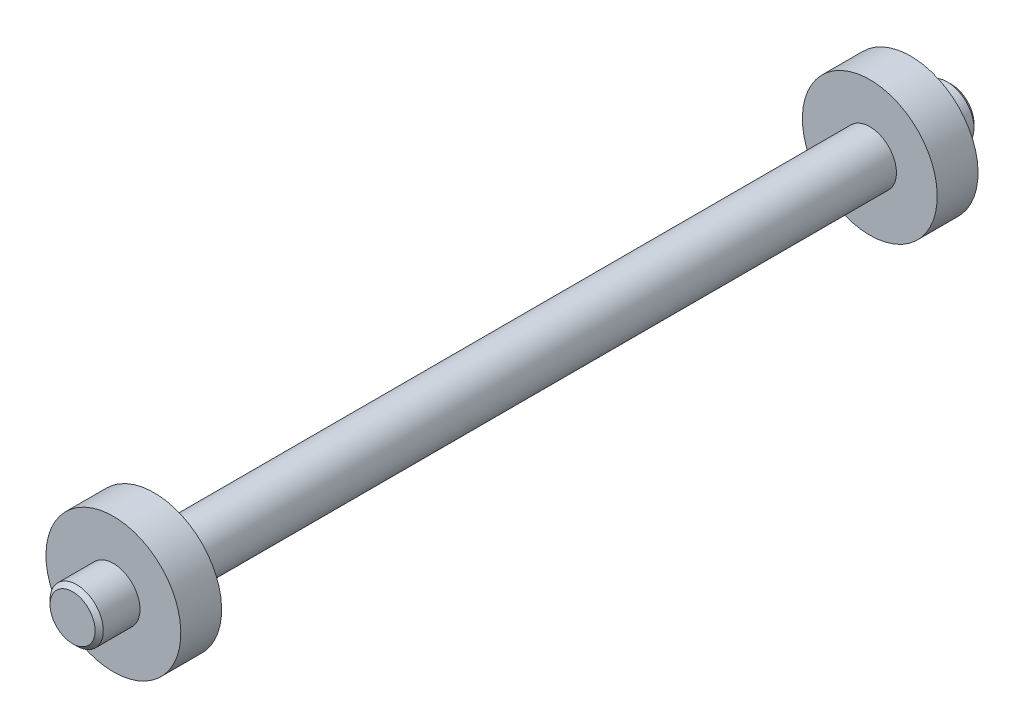
ISO-10303-21;
HEADER;
FILE_DESCRIPTION(('STEP AP214'),'2;1');
FILE_NAME('part.step','',(''),(''),'','','');
FILE_SCHEMA(('AUTOMOTIVE_DESIGN { 1 0 10303 214 1 1 1 1 }'));
ENDSEC;
DATA;
#1=APPLICATION_CONTEXT('core data for automotive mechanical design processes');
#2=APPLICATION_PROTOCOL_DEFINITION('international standard','automotive_design',2000,#1);
#3=PRODUCT_CONTEXT('',#1,'mechanical');
#4=PRODUCT('Part','Part','',(#3));
#5=PRODUCT_RELATED_PRODUCT_CATEGORY('part','',(#4));
#6=PRODUCT_DEFINITION_FORMATION('','',#4);
#7=PRODUCT_DEFINITION_CONTEXT('part definition',#1,'design');
#8=PRODUCT_DEFINITION('design','',#6,#7);
#9=PRODUCT_DEFINITION_SHAPE('','',#8);
#10=(LENGTH_UNIT() NAMED_UNIT(*) SI_UNIT(.MILLI.,.METRE.));
#11=(NAMED_UNIT(*) PLANE_ANGLE_UNIT() SI_UNIT($,.RADIAN.));
#12=(NAMED_UNIT(*) SI_UNIT($,.STERADIAN.) SOLID_ANGLE_UNIT());
#13=UNCERTAINTY_MEASURE_WITH_UNIT(LENGTH_MEASURE(1.E-05),#10,'distance_accuracy_value','');
#14=(GEOMETRIC_REPRESENTATION_CONTEXT(3) GLOBAL_UNCERTAINTY_ASSIGNED_CONTEXT((#13)) GLOBAL_UNIT_ASSIGNED_CONTEXT((#10,
#11,#12)) REPRESENTATION_CONTEXT('',''));
#15=CARTESIAN_POINT('',(0.,0.,0.));
#16=DIRECTION('',(0.,0.,1.));
#17=DIRECTION('',(1.,0.,0.));
#18=AXIS2_PLACEMENT_3D('',#15,#16,#17);
#19=CARTESIAN_POINT('',(0.,1.06,17.5));
#20=DIRECTION('',(0.,0.,-1.));
#21=DIRECTION('',(0.,1.,0.));
#22=AXIS2_PLACEMENT_3D('',#19,#20,#21);
#23=PLANE('',#22);
#24=CARTESIAN_POINT('',(0.,0.,17.5));
#25=DIRECTION('',(0.,0.,-1.));
#26=DIRECTION('',(0.,1.,0.));
#27=AXIS2_PLACEMENT_3D('',#24,#25,#26);
#28=CIRCLE('',#27,0.897499999999999);
#29=CARTESIAN_POINT('',(-0.897499999999997,0.,17.5));
#30=VERTEX_POINT('',#29);
#31=EDGE_CURVE('E36',#30,#30,#28,.F.);
#32=ORIENTED_EDGE('',*,*,#31,.T.);
#33=EDGE_LOOP('',(#32));
#34=FACE_BOUND('',#33,.T.);
#35=ADVANCED_FACE('F29',(#34),#23,.F.);
#36=CARTESIAN_POINT('',(0.,0.,17.5));
#37=DIRECTION('',(0.,0.,1.));
#38=DIRECTION('',(0.,-1.,0.));
#39=AXIS2_PLACEMENT_3D('',#36,#37,#38);
#40=CYLINDRICAL_SURFACE('',#39,1.06);
#41=CARTESIAN_POINT('',(0.,0.,17.3375));
#42=DIRECTION('',(0.,0.,-1.));
#43=DIRECTION('',(-1.,0.,0.));
#44=AXIS2_PLACEMENT_3D('',#41,#42,#43);
#45=CIRCLE('',#44,1.06);
#46=CARTESIAN_POINT('',(-1.06,0.,17.3375));
#47=VERTEX_POINT('',#46);
#48=EDGE_CURVE('E10',#47,#47,#45,.T.);
#49=ORIENTED_EDGE('',*,*,#48,.T.);
#50=EDGE_LOOP('',(#49));
#51=FACE_BOUND('',#50,.T.);
#52=CARTESIAN_POINT('',(0.,0.,15.875));
#53=DIRECTION('',(0.,0.,1.));
#54=DIRECTION('',(0.,-1.,0.));
#55=AXIS2_PLACEMENT_3D('',#52,#53,#54);
#56=CIRCLE('',#55,1.06);
#57=CARTESIAN_POINT('',(0.,-1.06,15.875));
#58=VERTEX_POINT('',#57);
#59=EDGE_CURVE('E49',#58,#58,#56,.T.);
#60=ORIENTED_EDGE('',*,*,#59,.T.);
#61=EDGE_LOOP('',(#60));
#62=FACE_BOUND('',#61,.T.);
#63=ADVANCED_FACE('F92',(#51,#62),#40,.T.);
#64=CARTESIAN_POINT('',(0.,2.685,15.875));
#65=DIRECTION('',(0.,0.,-1.));
#66=DIRECTION('',(0.,1.,0.));
#67=AXIS2_PLACEMENT_3D('',#64,#65,#66);
#68=PLANE('',#67);
#69=ORIENTED_EDGE('',*,*,#59,.F.);
#70=EDGE_LOOP('',(#69));
#71=FACE_BOUND('',#70,.T.);
#72=CARTESIAN_POINT('',(0.,0.,15.875));
#73=DIRECTION('',(0.,0.,1.));
#74=DIRECTION('',(0.,-1.,0.));
#75=AXIS2_PLACEMENT_3D('',#72,#73,#74);
#76=CIRCLE('',#75,2.685);
#77=CARTESIAN_POINT('',(0.,-2.685,15.875));
#78=VERTEX_POINT('',#77);
#79=EDGE_CURVE('E52',#78,#78,#76,.T.);
#80=ORIENTED_EDGE('',*,*,#79,.T.);
#81=EDGE_LOOP('',(#80));
#82=FACE_BOUND('',#81,.T.);
#83=ADVANCED_FACE('F97',(#71,#82),#68,.F.);
#84=CARTESIAN_POINT('',(0.,0.,17.5));
#85=DIRECTION('',(0.,0.,1.));
#86=DIRECTION('',(0.,-1.,0.));
#87=AXIS2_PLACEMENT_3D('',#84,#85,#86);
#88=CYLINDRICAL_SURFACE('',#87,2.685);
#89=ORIENTED_EDGE('',*,*,#79,.F.);
#90=EDGE_LOOP('',(#89));
#91=FACE_BOUND('',#90,.T.);
#92=CARTESIAN_POINT('',(0.,0.,14.25));
#93=DIRECTION('',(0.,0.,1.));
#94=DIRECTION('',(0.,-1.,0.));
#95=AXIS2_PLACEMENT_3D('',#92,#93,#94);
#96=CIRCLE('',#95,2.685);
#97=CARTESIAN_POINT('',(0.,-2.685,14.25));
#98=VERTEX_POINT('',#97);
#99=EDGE_CURVE('E55',#98,#98,#96,.T.);
#100=ORIENTED_EDGE('',*,*,#99,.T.);
#101=EDGE_LOOP('',(#100));
#102=FACE_BOUND('',#101,.T.);
#103=ADVANCED_FACE('F183',(#91,#102),#88,.T.);
#104=CARTESIAN_POINT('',(0.,1.06,14.25));
#105=DIRECTION('',(0.,0.,1.));
#106=DIRECTION('',(0.,-1.,0.));
#107=AXIS2_PLACEMENT_3D('',#104,#105,#106);
#108=PLANE('',#107);
#109=ORIENTED_EDGE('',*,*,#99,.F.);
#110=EDGE_LOOP('',(#109));
#111=FACE_BOUND('',#110,.T.);
#112=CARTESIAN_POINT('',(0.,0.,14.25));
#113=DIRECTION('',(0.,0.,1.));
#114=DIRECTION('',(0.,-1.,0.));
#115=AXIS2_PLACEMENT_3D('',#112,#113,#114);
#116=CIRCLE('',#115,1.06);
#117=CARTESIAN_POINT('',(0.,-1.06,14.25));
#118=VERTEX_POINT('',#117);
#119=EDGE_CURVE('E58',#118,#118,#116,.T.);
#120=ORIENTED_EDGE('',*,*,#119,.T.);
#121=EDGE_LOOP('',(#120));
#122=FACE_BOUND('',#121,.T.);
#123=ADVANCED_FACE('F173',(#111,#122),#108,.F.);
#124=CARTESIAN_POINT('',(0.,0.,17.5));
#125=DIRECTION('',(0.,0.,1.));
#126=DIRECTION('',(0.,-1.,0.));
#127=AXIS2_PLACEMENT_3D('',#124,#125,#126);
#128=CYLINDRICAL_SURFACE('',#127,1.06);
#129=ORIENTED_EDGE('',*,*,#119,.F.);
#130=EDGE_LOOP('',(#129));
#131=FACE_BOUND('',#130,.T.);
#132=CARTESIAN_POINT('',(0.,0.,-14.25));
#133=DIRECTION('',(0.,0.,1.));
#134=DIRECTION('',(0.,-1.,0.));
#135=AXIS2_PLACEMENT_3D('',#132,#133,#134);
#136=CIRCLE('',#135,1.06);
#137=CARTESIAN_POINT('',(0.,-1.06,-14.25));
#138=VERTEX_POINT('',#137);
#139=EDGE_CURVE('E61',#138,#138,#136,.T.);
#140=ORIENTED_EDGE('',*,*,#139,.T.);
#141=EDGE_LOOP('',(#140));
#142=FACE_BOUND('',#141,.T.);
#143=ADVANCED_FACE('F163',(#131,#142),#128,.T.);
#144=CARTESIAN_POINT('',(0.,2.685,-14.25));
#145=DIRECTION('',(0.,0.,-1.));
#146=DIRECTION('',(0.,1.,0.));
#147=AXIS2_PLACEMENT_3D('',#144,#145,#146);
#148=PLANE('',#147);
#149=ORIENTED_EDGE('',*,*,#139,.F.);
#150=EDGE_LOOP('',(#149));
#151=FACE_BOUND('',#150,.T.);
#152=CARTESIAN_POINT('',(0.,0.,-14.25));
#153=DIRECTION('',(0.,0.,1.));
#154=DIRECTION('',(0.,-1.,0.));
#155=AXIS2_PLACEMENT_3D('',#152,#153,#154);
#156=CIRCLE('',#155,2.685);
#157=CARTESIAN_POINT('',(0.,-2.685,-14.25));
#158=VERTEX_POINT('',#157);
#159=EDGE_CURVE('E64',#158,#158,#156,.T.);
#160=ORIENTED_EDGE('',*,*,#159,.T.);
#161=EDGE_LOOP('',(#160));
#162=FACE_BOUND('',#161,.T.);
#163=ADVANCED_FACE('F153',(#151,#162),#148,.F.);
#164=CARTESIAN_POINT('',(0.,0.,17.5));
#165=DIRECTION('',(0.,0.,1.));
#166=DIRECTION('',(0.,-1.,0.));
#167=AXIS2_PLACEMENT_3D('',#164,#165,#166);
#168=CYLINDRICAL_SURFACE('',#167,2.685);
#169=ORIENTED_EDGE('',*,*,#159,.F.);
#170=EDGE_LOOP('',(#169));
#171=FACE_BOUND('',#170,.T.);
#172=CARTESIAN_POINT('',(0.,0.,-15.875));
#173=DIRECTION('',(0.,0.,1.));
#174=DIRECTION('',(0.,-1.,0.));
#175=AXIS2_PLACEMENT_3D('',#172,#173,#174);
#176=CIRCLE('',#175,2.685);
#177=CARTESIAN_POINT('',(0.,-2.685,-15.875));
#178=VERTEX_POINT('',#177);
#179=EDGE_CURVE('E67',#178,#178,#176,.T.);
#180=ORIENTED_EDGE('',*,*,#179,.T.);
#181=EDGE_LOOP('',(#180));
#182=FACE_BOUND('',#181,.T.);
#183=ADVANCED_FACE('F88',(#171,#182),#168,.T.);
#184=CARTESIAN_POINT('',(0.,1.06,-15.875));
#185=DIRECTION('',(0.,0.,1.));
#186=DIRECTION('',(0.,-1.,0.));
#187=AXIS2_PLACEMENT_3D('',#184,#185,#186);
#188=PLANE('',#187);
#189=ORIENTED_EDGE('',*,*,#179,.F.);
#190=EDGE_LOOP('',(#189));
#191=FACE_BOUND('',#190,.T.);
#192=CARTESIAN_POINT('',(0.,0.,-15.875));
#193=DIRECTION('',(0.,0.,1.));
#194=DIRECTION('',(0.,-1.,0.));
#195=AXIS2_PLACEMENT_3D('',#192,#193,#194);
#196=CIRCLE('',#195,1.06);
#197=CARTESIAN_POINT('',(0.,-1.06,-15.875));
#198=VERTEX_POINT('',#197);
#199=EDGE_CURVE('E70',#198,#198,#196,.T.);
#200=ORIENTED_EDGE('',*,*,#199,.T.);
#201=EDGE_LOOP('',(#200));
#202=FACE_BOUND('',#201,.T.);
#203=ADVANCED_FACE('F74',(#191,#202),#188,.F.);
#204=CARTESIAN_POINT('',(0.,0.,17.5));
#205=DIRECTION('',(0.,0.,1.));
#206=DIRECTION('',(0.,-1.,0.));
#207=AXIS2_PLACEMENT_3D('',#204,#205,#206);
#208=CYLINDRICAL_SURFACE('',#207,1.06);
#209=CARTESIAN_POINT('',(0.,0.,-17.3375));
#210=DIRECTION('',(0.,0.,1.));
#211=DIRECTION('',(1.,0.,0.));
#212=AXIS2_PLACEMENT_3D('',#209,#210,#211);
#213=CIRCLE('',#212,1.06);
#214=CARTESIAN_POINT('',(1.06,0.,-17.3375));
#215=VERTEX_POINT('',#214);
#216=EDGE_CURVE('E44',#215,#215,#213,.T.);
#217=ORIENTED_EDGE('',*,*,#216,.T.);
#218=EDGE_LOOP('',(#217));
#219=FACE_BOUND('',#218,.T.);
#220=ORIENTED_EDGE('',*,*,#199,.F.);
#221=EDGE_LOOP('',(#220));
#222=FACE_BOUND('',#221,.T.);
#223=ADVANCED_FACE('F76',(#219,#222),#208,.T.);
#224=CARTESIAN_POINT('',(0.,0.,-17.5));
#225=DIRECTION('',(0.,0.,1.));
#226=DIRECTION('',(0.,-1.,0.));
#227=AXIS2_PLACEMENT_3D('',#224,#225,#226);
#228=PLANE('',#227);
#229=CARTESIAN_POINT('',(0.,0.,-17.5));
#230=DIRECTION('',(0.,0.,1.));
#231=DIRECTION('',(0.,-1.,0.));
#232=AXIS2_PLACEMENT_3D('',#229,#230,#231);
#233=CIRCLE('',#232,0.897500000000006);
#234=CARTESIAN_POINT('',(0.,-0.897500000000007,-17.5));
#235=VERTEX_POINT('',#234);
#236=EDGE_CURVE('E40',#235,#235,#233,.F.);
#237=ORIENTED_EDGE('',*,*,#236,.T.);
#238=EDGE_LOOP('',(#237));
#239=FACE_BOUND('',#238,.T.);
#240=ADVANCED_FACE('F78',(#239),#228,.F.);
#241=CARTESIAN_POINT('',(0.,0.,-17.3375));
#242=DIRECTION('',(0.,0.,1.));
#243=DIRECTION('',(1.,0.,0.));
#244=AXIS2_PLACEMENT_3D('',#241,#242,#243);
#245=CONICAL_SURFACE('',#244,1.06,0.785398163397446);
#246=ORIENTED_EDGE('',*,*,#236,.F.);
#247=EDGE_LOOP('',(#246));
#248=FACE_BOUND('',#247,.T.);
#249=ORIENTED_EDGE('',*,*,#216,.F.);
#250=EDGE_LOOP('',(#249));
#251=FACE_BOUND('',#250,.T.);
#252=ADVANCED_FACE('F85',(#248,#251),#245,.T.);
#253=CARTESIAN_POINT('',(0.,0.,17.5));
#254=DIRECTION('',(0.,0.,-1.));
#255=DIRECTION('',(-1.,0.,0.));
#256=AXIS2_PLACEMENT_3D('',#253,#254,#255);
#257=CONICAL_SURFACE('',#256,0.897499999999999,0.785398163397436);
#258=CARTESIAN_POINT('',(-1.06,0.,17.3375));
#259=CARTESIAN_POINT('',(-1.05830729166667,0.,17.3391927083333));
#260=CARTESIAN_POINT('',(-1.05661458333333,0.,17.3408854166667));
#261=CARTESIAN_POINT('',(-1.05322916666667,0.,17.3442708333333));
#262=CARTESIAN_POINT('',(-1.05153645833333,0.,17.3459635416667));
#263=CARTESIAN_POINT('',(-1.04815104166667,0.,17.3493489583333));
#264=CARTESIAN_POINT('',(-1.04645833333333,0.,17.3510416666667));
#265=CARTESIAN_POINT('',(-1.04307291666667,0.,17.3544270833333));
#266=CARTESIAN_POINT('',(-1.04138020833333,0.,17.3561197916667));
#267=CARTESIAN_POINT('',(-1.03799479166667,0.,17.3595052083333));
#268=CARTESIAN_POINT('',(-1.03630208333333,0.,17.3611979166667));
#269=CARTESIAN_POINT('',(-1.03291666666667,0.,17.3645833333333));
#270=CARTESIAN_POINT('',(-1.03122395833333,0.,17.3662760416667));
#271=CARTESIAN_POINT('',(-1.02783854166667,0.,17.3696614583333));
#272=CARTESIAN_POINT('',(-1.02614583333333,0.,17.3713541666667));
#273=CARTESIAN_POINT('',(-1.02276041666667,0.,17.3747395833333));
#274=CARTESIAN_POINT('',(-1.02106770833333,0.,17.3764322916667));
#275=CARTESIAN_POINT('',(-1.01768229166667,0.,17.3798177083333));
#276=CARTESIAN_POINT('',(-1.01598958333333,0.,17.3815104166667));
#277=CARTESIAN_POINT('',(-1.01260416666667,0.,17.3848958333333));
#278=CARTESIAN_POINT('',(-1.01091145833333,0.,17.3865885416667));
#279=CARTESIAN_POINT('',(-1.00752604166667,0.,17.3899739583333));
#280=CARTESIAN_POINT('',(-1.00583333333333,0.,17.3916666666667));
#281=CARTESIAN_POINT('',(-1.00244791666667,0.,17.3950520833333));
#282=CARTESIAN_POINT('',(-1.00075520833333,0.,17.3967447916667));
#283=CARTESIAN_POINT('',(-0.997369791666665,0.,17.4001302083333));
#284=CARTESIAN_POINT('',(-0.995677083333332,0.,17.4018229166667));
#285=CARTESIAN_POINT('',(-0.992291666666665,0.,17.4052083333333));
#286=CARTESIAN_POINT('',(-0.990598958333332,0.,17.4069010416667));
#287=CARTESIAN_POINT('',(-0.987213541666665,0.,17.4102864583333));
#288=CARTESIAN_POINT('',(-0.985520833333332,0.,17.4119791666667));
#289=CARTESIAN_POINT('',(-0.982135416666666,0.,17.4153645833333));
#290=CARTESIAN_POINT('',(-0.980442708333332,0.,17.4170572916667));
#291=CARTESIAN_POINT('',(-0.977057291666665,0.,17.4204427083333));
#292=CARTESIAN_POINT('',(-0.975364583333331,0.,17.4221354166667));
#293=CARTESIAN_POINT('',(-0.971979166666665,0.,17.4255208333333));
#294=CARTESIAN_POINT('',(-0.970286458333332,0.,17.4272135416667));
#295=CARTESIAN_POINT('',(-0.966901041666665,0.,17.4305989583333));
#296=CARTESIAN_POINT('',(-0.965208333333331,0.,17.4322916666667));
#297=CARTESIAN_POINT('',(-0.961822916666665,0.,17.4356770833333));
#298=CARTESIAN_POINT('',(-0.960130208333332,0.,17.4373697916667));
#299=CARTESIAN_POINT('',(-0.956744791666665,0.,17.4407552083333));
#300=CARTESIAN_POINT('',(-0.955052083333331,0.,17.4424479166667));
#301=CARTESIAN_POINT('',(-0.951666666666664,0.,17.4458333333333));
#302=CARTESIAN_POINT('',(-0.949973958333332,0.,17.4475260416667));
#303=CARTESIAN_POINT('',(-0.946588541666665,0.,17.4509114583333));
#304=CARTESIAN_POINT('',(-0.944895833333331,0.,17.4526041666667));
#305=CARTESIAN_POINT('',(-0.941510416666664,0.,17.4559895833333));
#306=CARTESIAN_POINT('',(-0.939817708333331,0.,17.4576822916667));
#307=CARTESIAN_POINT('',(-0.936432291666665,0.,17.4610677083333));
#308=CARTESIAN_POINT('',(-0.934739583333331,0.,17.4627604166667));
#309=CARTESIAN_POINT('',(-0.931354166666664,0.,17.4661458333333));
#310=CARTESIAN_POINT('',(-0.929661458333331,0.,17.4678385416667));
#311=CARTESIAN_POINT('',(-0.926276041666665,0.,17.4712239583333));
#312=CARTESIAN_POINT('',(-0.924583333333331,0.,17.4729166666667));
#313=CARTESIAN_POINT('',(-0.921197916666664,0.,17.4763020833333));
#314=CARTESIAN_POINT('',(-0.919505208333331,0.,17.4779947916667));
#315=CARTESIAN_POINT('',(-0.916119791666664,0.,17.4813802083333));
#316=CARTESIAN_POINT('',(-0.914427083333331,0.,17.4830729166667));
#317=CARTESIAN_POINT('',(-0.911041666666664,0.,17.4864583333333));
#318=CARTESIAN_POINT('',(-0.909348958333331,0.,17.4881510416667));
#319=CARTESIAN_POINT('',(-0.905963541666664,0.,17.4915364583333));
#320=CARTESIAN_POINT('',(-0.904270833333331,0.,17.4932291666667));
#321=CARTESIAN_POINT('',(-0.900885416666664,0.,17.4966145833333));
#322=CARTESIAN_POINT('',(-0.89919270833333,0.,17.4983072916667));
#323=CARTESIAN_POINT('',(-0.897499999999997,0.,17.5));
#324=B_SPLINE_CURVE_WITH_KNOTS('',3,(#258,#259,#260,#261,#262,#263,#264,#265,#266,#267,#268,
#269,#270,#271,#272,#273,#274,#275,#276,#277,#278,#279,#280,#281,#282,#283,#284,#285,#286,#287,
#288,#289,#290,#291,#292,#293,#294,#295,#296,#297,#298,#299,#300,#301,#302,#303,#304,#305,#306,
#307,#308,#309,#310,#311,#312,#313,#314,#315,#316,#317,#318,#319,#320,#321,#322,#323),
.UNSPECIFIED.,.F.,.F.,(4,2,2,2,2,2,2,2,2,2,2,2,2,2,2,2,2,2,2,2,2,2,2,2,2,2,2,2,2,2,2,2,4),(0.,
0.00718155324642738,0.0143631064928523,0.0215446597392797,0.0287262129857045,0.0359077662321319,
0.0430893194785568,0.0502708727249842,0.0574524259714091,0.0646339792178365,0.0718155324642614,
0.0789970857106888,0.0861786389571137,0.0933601922035411,0.100541745449966,0.107723298696393,
0.114904851942818,0.122086405189243,0.129267958435671,0.136449511682095,0.143631064928523,
0.150812618174948,0.157994171421375,0.1651757246678,0.172357277914227,0.179538831160652,
0.18672038440708,0.193901937653505,0.201083490899932,0.208265044146357,0.215446597392784,
0.222628150639209,0.229809703885634),.UNSPECIFIED.);
#325=EDGE_CURVE('BSEAM31',#47,#30,#324,.T.);
#326=ORIENTED_EDGE('',*,*,#48,.F.);
#327=ORIENTED_EDGE('',*,*,#31,.F.);
#328=ORIENTED_EDGE('',*,*,#325,.T.);
#329=ORIENTED_EDGE('',*,*,#325,.F.);
#330=EDGE_LOOP('',(#326,#328,#327,#329));
#331=FACE_BOUND('',#330,.T.);
#332=ADVANCED_FACE('F31',(#331),#257,.T.);
#333=CLOSED_SHELL('',(#35,#63,#83,#103,#123,#143,#163,#183,#203,#223,#240,#252,#332));
#334=MANIFOLD_SOLID_BREP('B2',#333);
#335=ADVANCED_BREP_SHAPE_REPRESENTATION('',(#18,#334),#14);
#336=SHAPE_DEFINITION_REPRESENTATION(#9,#335);
ENDSEC;
END-ISO-10303-21;
